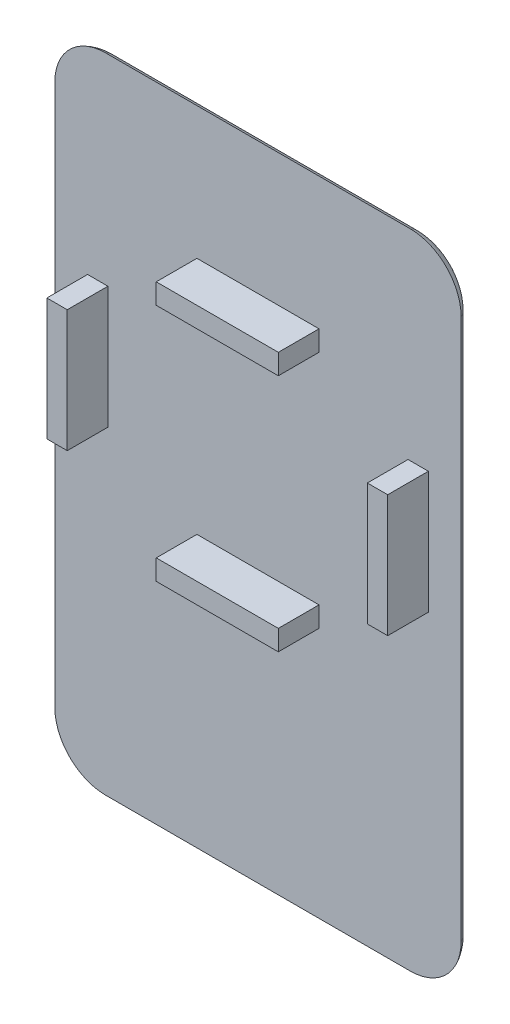
ISO-10303-21;
HEADER;
FILE_DESCRIPTION(('STEP AP214'),'2;1');
FILE_NAME('part.step','',(''),(''),'','','');
FILE_SCHEMA(('AUTOMOTIVE_DESIGN { 1 0 10303 214 1 1 1 1 }'));
ENDSEC;
DATA;
#1=APPLICATION_CONTEXT('core data for automotive mechanical design processes');
#2=APPLICATION_PROTOCOL_DEFINITION('international standard','automotive_design',2000,#1);
#3=PRODUCT_CONTEXT('',#1,'mechanical');
#4=PRODUCT('Part','Part','',(#3));
#5=PRODUCT_RELATED_PRODUCT_CATEGORY('part','',(#4));
#6=PRODUCT_DEFINITION_FORMATION('','',#4);
#7=PRODUCT_DEFINITION_CONTEXT('part definition',#1,'design');
#8=PRODUCT_DEFINITION('design','',#6,#7);
#9=PRODUCT_DEFINITION_SHAPE('','',#8);
#10=(LENGTH_UNIT() NAMED_UNIT(*) SI_UNIT(.MILLI.,.METRE.));
#11=(NAMED_UNIT(*) PLANE_ANGLE_UNIT() SI_UNIT($,.RADIAN.));
#12=(NAMED_UNIT(*) SI_UNIT($,.STERADIAN.) SOLID_ANGLE_UNIT());
#13=UNCERTAINTY_MEASURE_WITH_UNIT(LENGTH_MEASURE(1.E-05),#10,'distance_accuracy_value','');
#14=(GEOMETRIC_REPRESENTATION_CONTEXT(3) GLOBAL_UNCERTAINTY_ASSIGNED_CONTEXT((#13)) GLOBAL_UNIT_ASSIGNED_CONTEXT((#10,
#11,#12)) REPRESENTATION_CONTEXT('',''));
#15=CARTESIAN_POINT('',(0.,0.,0.));
#16=DIRECTION('',(0.,0.,1.));
#17=DIRECTION('',(1.,0.,0.));
#18=AXIS2_PLACEMENT_3D('',#15,#16,#17);
#19=CARTESIAN_POINT('',(0.,0.,1.2));
#20=DIRECTION('',(0.,0.,1.));
#21=DIRECTION('',(1.,0.,0.));
#22=AXIS2_PLACEMENT_3D('',#19,#20,#21);
#23=PLANE('',#22);
#24=DIRECTION('',(-1.,0.,0.));
#25=VECTOR('',#24,1.);
#26=CARTESIAN_POINT('',(-19.97,31.595,1.2));
#27=LINE('',#26,#25);
#28=CARTESIAN_POINT('',(14.97,31.595,1.2));
#29=VERTEX_POINT('',#28);
#30=CARTESIAN_POINT('',(-14.97,31.595,1.2));
#31=VERTEX_POINT('',#30);
#32=EDGE_CURVE('E364',#29,#31,#27,.T.);
#33=ORIENTED_EDGE('',*,*,#32,.T.);
#34=CARTESIAN_POINT('',(-14.97,26.595,1.2));
#35=DIRECTION('',(0.,0.,1.));
#36=DIRECTION('',(1.,0.,0.));
#37=AXIS2_PLACEMENT_3D('',#34,#35,#36);
#38=CIRCLE('',#37,5.);
#39=CARTESIAN_POINT('',(-19.97,26.595,1.2));
#40=VERTEX_POINT('',#39);
#41=EDGE_CURVE('E383',#31,#40,#38,.T.);
#42=ORIENTED_EDGE('',*,*,#41,.T.);
#43=DIRECTION('',(0.,-1.,0.));
#44=VECTOR('',#43,1.);
#45=CARTESIAN_POINT('',(-19.97,31.595,1.2));
#46=LINE('',#45,#44);
#47=CARTESIAN_POINT('',(-19.97,-26.595,1.2));
#48=VERTEX_POINT('',#47);
#49=EDGE_CURVE('E367',#40,#48,#46,.T.);
#50=ORIENTED_EDGE('',*,*,#49,.T.);
#51=CARTESIAN_POINT('',(-14.97,-26.595,1.2));
#52=DIRECTION('',(0.,0.,1.));
#53=DIRECTION('',(1.,0.,0.));
#54=AXIS2_PLACEMENT_3D('',#51,#52,#53);
#55=CIRCLE('',#54,5.);
#56=CARTESIAN_POINT('',(-14.97,-31.595,1.2));
#57=VERTEX_POINT('',#56);
#58=EDGE_CURVE('E373',#48,#57,#55,.T.);
#59=ORIENTED_EDGE('',*,*,#58,.T.);
#60=DIRECTION('',(1.,0.,0.));
#61=VECTOR('',#60,1.);
#62=CARTESIAN_POINT('',(-19.97,-31.595,1.2));
#63=LINE('',#62,#61);
#64=CARTESIAN_POINT('',(14.97,-31.595,1.2));
#65=VERTEX_POINT('',#64);
#66=EDGE_CURVE('E370',#57,#65,#63,.T.);
#67=ORIENTED_EDGE('',*,*,#66,.T.);
#68=CARTESIAN_POINT('',(14.97,-26.595,1.2));
#69=DIRECTION('',(0.,0.,1.));
#70=DIRECTION('',(1.,0.,0.));
#71=AXIS2_PLACEMENT_3D('',#68,#69,#70);
#72=CIRCLE('',#71,5.);
#73=CARTESIAN_POINT('',(19.97,-26.595,1.2));
#74=VERTEX_POINT('',#73);
#75=EDGE_CURVE('E377',#65,#74,#72,.T.);
#76=ORIENTED_EDGE('',*,*,#75,.T.);
#77=DIRECTION('',(0.,1.,0.));
#78=VECTOR('',#77,1.);
#79=CARTESIAN_POINT('',(19.97,31.595,1.2));
#80=LINE('',#79,#78);
#81=CARTESIAN_POINT('',(19.97,26.595,1.2));
#82=VERTEX_POINT('',#81);
#83=EDGE_CURVE('E361',#74,#82,#80,.T.);
#84=ORIENTED_EDGE('',*,*,#83,.T.);
#85=CARTESIAN_POINT('',(14.97,26.595,1.2));
#86=DIRECTION('',(0.,0.,1.));
#87=DIRECTION('',(1.,0.,0.));
#88=AXIS2_PLACEMENT_3D('',#85,#86,#87);
#89=CIRCLE('',#88,5.);
#90=EDGE_CURVE('E380',#82,#29,#89,.T.);
#91=ORIENTED_EDGE('',*,*,#90,.T.);
#92=EDGE_LOOP('',(#33,#42,#50,#59,#67,#76,#84,#91));
#93=FACE_BOUND('',#92,.T.);
#94=DIRECTION('',(-1.,0.,0.));
#95=VECTOR('',#94,1.);
#96=CARTESIAN_POINT('',(-5.99999999999997,18.595,1.2));
#97=LINE('',#96,#95);
#98=CARTESIAN_POINT('',(6.00000000000003,18.595,1.2));
#99=VERTEX_POINT('',#98);
#100=CARTESIAN_POINT('',(-5.99999999999997,18.595,1.2));
#101=VERTEX_POINT('',#100);
#102=EDGE_CURVE('E338',#99,#101,#97,.T.);
#103=ORIENTED_EDGE('',*,*,#102,.F.);
#104=DIRECTION('',(0.,1.,0.));
#105=VECTOR('',#104,1.);
#106=CARTESIAN_POINT('',(6.00000000000003,18.595,1.2));
#107=LINE('',#106,#105);
#108=CARTESIAN_POINT('',(6.00000000000003,16.595,1.2));
#109=VERTEX_POINT('',#108);
#110=EDGE_CURVE('E319',#109,#99,#107,.T.);
#111=ORIENTED_EDGE('',*,*,#110,.F.);
#112=DIRECTION('',(1.,0.,0.));
#113=VECTOR('',#112,1.);
#114=CARTESIAN_POINT('',(-5.99999999999997,16.595,1.2));
#115=LINE('',#114,#113);
#116=CARTESIAN_POINT('',(-5.99999999999997,16.595,1.2));
#117=VERTEX_POINT('',#116);
#118=EDGE_CURVE('E325',#117,#109,#115,.T.);
#119=ORIENTED_EDGE('',*,*,#118,.F.);
#120=DIRECTION('',(0.,-1.,0.));
#121=VECTOR('',#120,1.);
#122=CARTESIAN_POINT('',(-5.99999999999997,18.595,1.2));
#123=LINE('',#122,#121);
#124=EDGE_CURVE('E341',#101,#117,#123,.T.);
#125=ORIENTED_EDGE('',*,*,#124,.F.);
#126=EDGE_LOOP('',(#103,#111,#119,#125));
#127=FACE_BOUND('',#126,.T.);
#128=DIRECTION('',(-1.,0.,0.));
#129=VECTOR('',#128,1.);
#130=CARTESIAN_POINT('',(-6.00000000000001,-4.90499999999999,1.2));
#131=LINE('',#130,#129);
#132=CARTESIAN_POINT('',(6.00000000000003,-4.90499999999999,1.2));
#133=VERTEX_POINT('',#132);
#134=CARTESIAN_POINT('',(-6.00000000000001,-4.90499999999999,1.2));
#135=VERTEX_POINT('',#134);
#136=EDGE_CURVE('E297',#133,#135,#131,.T.);
#137=ORIENTED_EDGE('',*,*,#136,.F.);
#138=DIRECTION('',(0.,1.,0.));
#139=VECTOR('',#138,1.);
#140=CARTESIAN_POINT('',(6.00000000000003,-4.90499999999999,1.2));
#141=LINE('',#140,#139);
#142=CARTESIAN_POINT('',(6.00000000000003,-6.90499999999999,1.2));
#143=VERTEX_POINT('',#142);
#144=EDGE_CURVE('E278',#143,#133,#141,.T.);
#145=ORIENTED_EDGE('',*,*,#144,.F.);
#146=DIRECTION('',(1.,0.,0.));
#147=VECTOR('',#146,1.);
#148=CARTESIAN_POINT('',(-6.00000000000001,-6.90499999999999,1.2));
#149=LINE('',#148,#147);
#150=CARTESIAN_POINT('',(-6.00000000000001,-6.90499999999999,1.2));
#151=VERTEX_POINT('',#150);
#152=EDGE_CURVE('E284',#151,#143,#149,.T.);
#153=ORIENTED_EDGE('',*,*,#152,.F.);
#154=DIRECTION('',(0.,-1.,0.));
#155=VECTOR('',#154,1.);
#156=CARTESIAN_POINT('',(-6.00000000000001,-4.90499999999999,1.2));
#157=LINE('',#156,#155);
#158=EDGE_CURVE('E300',#135,#151,#157,.T.);
#159=ORIENTED_EDGE('',*,*,#158,.F.);
#160=EDGE_LOOP('',(#137,#145,#153,#159));
#161=FACE_BOUND('',#160,.T.);
#162=DIRECTION('',(-1.,0.,0.));
#163=VECTOR('',#162,1.);
#164=CARTESIAN_POINT('',(14.75,11.845,1.2));
#165=LINE('',#164,#163);
#166=CARTESIAN_POINT('',(16.75,11.845,1.2));
#167=VERTEX_POINT('',#166);
#168=CARTESIAN_POINT('',(14.75,11.845,1.2));
#169=VERTEX_POINT('',#168);
#170=EDGE_CURVE('E239',#167,#169,#165,.T.);
#171=ORIENTED_EDGE('',*,*,#170,.F.);
#172=DIRECTION('',(0.,1.,0.));
#173=VECTOR('',#172,1.);
#174=CARTESIAN_POINT('',(16.75,11.845,1.2));
#175=LINE('',#174,#173);
#176=CARTESIAN_POINT('',(16.75,-0.154999999999992,1.2));
#177=VERTEX_POINT('',#176);
#178=EDGE_CURVE('E234',#177,#167,#175,.T.);
#179=ORIENTED_EDGE('',*,*,#178,.F.);
#180=DIRECTION('',(1.,0.,0.));
#181=VECTOR('',#180,1.);
#182=CARTESIAN_POINT('',(14.75,-0.154999999999992,1.2));
#183=LINE('',#182,#181);
#184=CARTESIAN_POINT('',(14.75,-0.154999999999992,1.2));
#185=VERTEX_POINT('',#184);
#186=EDGE_CURVE('E249',#185,#177,#183,.T.);
#187=ORIENTED_EDGE('',*,*,#186,.F.);
#188=DIRECTION('',(0.,-1.,0.));
#189=VECTOR('',#188,1.);
#190=CARTESIAN_POINT('',(14.75,11.845,1.2));
#191=LINE('',#190,#189);
#192=EDGE_CURVE('E261',#169,#185,#191,.T.);
#193=ORIENTED_EDGE('',*,*,#192,.F.);
#194=EDGE_LOOP('',(#171,#179,#187,#193));
#195=FACE_BOUND('',#194,.T.);
#196=DIRECTION('',(-1.,0.,0.));
#197=VECTOR('',#196,1.);
#198=CARTESIAN_POINT('',(-14.75,11.845,1.2));
#199=LINE('',#198,#197);
#200=CARTESIAN_POINT('',(-14.75,11.845,1.2));
#201=VERTEX_POINT('',#200);
#202=CARTESIAN_POINT('',(-16.75,11.845,1.2));
#203=VERTEX_POINT('',#202);
#204=EDGE_CURVE('E761',#201,#203,#199,.T.);
#205=ORIENTED_EDGE('',*,*,#204,.F.);
#206=DIRECTION('',(0.,1.,0.));
#207=VECTOR('',#206,1.);
#208=CARTESIAN_POINT('',(-14.75,11.845,1.2));
#209=LINE('',#208,#207);
#210=CARTESIAN_POINT('',(-14.75,-0.154999999999995,1.2));
#211=VERTEX_POINT('',#210);
#212=EDGE_CURVE('E231',#211,#201,#209,.T.);
#213=ORIENTED_EDGE('',*,*,#212,.F.);
#214=DIRECTION('',(1.,0.,0.));
#215=VECTOR('',#214,1.);
#216=CARTESIAN_POINT('',(-14.75,-0.154999999999995,1.2));
#217=LINE('',#216,#215);
#218=CARTESIAN_POINT('',(-16.75,-0.154999999999996,1.2));
#219=VERTEX_POINT('',#218);
#220=EDGE_CURVE('E227',#219,#211,#217,.T.);
#221=ORIENTED_EDGE('',*,*,#220,.F.);
#222=DIRECTION('',(0.,-1.,0.));
#223=VECTOR('',#222,1.);
#224=CARTESIAN_POINT('',(-16.75,11.845,1.2));
#225=LINE('',#224,#223);
#226=EDGE_CURVE('E757',#203,#219,#225,.T.);
#227=ORIENTED_EDGE('',*,*,#226,.F.);
#228=EDGE_LOOP('',(#205,#213,#221,#227));
#229=FACE_BOUND('',#228,.T.);
#230=ADVANCED_FACE('F41',(#93,#127,#161,#195,#229),#23,.T.);
#231=CARTESIAN_POINT('',(0.,0.,0.));
#232=DIRECTION('',(0.,0.,1.));
#233=DIRECTION('',(1.,0.,0.));
#234=AXIS2_PLACEMENT_3D('',#231,#232,#233);
#235=PLANE('',#234);
#236=DIRECTION('',(1.,0.,0.));
#237=VECTOR('',#236,1.);
#238=CARTESIAN_POINT('',(0.,-29.7619697220177,0.));
#239=LINE('',#238,#237);
#240=CARTESIAN_POINT('',(14.97,-29.7619697220177,0.));
#241=VERTEX_POINT('',#240);
#242=CARTESIAN_POINT('',(-14.97,-29.7619697220177,0.));
#243=VERTEX_POINT('',#242);
#244=EDGE_CURVE('E51',#241,#243,#239,.F.);
#245=ORIENTED_EDGE('',*,*,#244,.T.);
#246=CARTESIAN_POINT('',(-14.97,-26.595,0.));
#247=DIRECTION('',(0.,0.,1.));
#248=DIRECTION('',(1.,0.,0.));
#249=AXIS2_PLACEMENT_3D('',#246,#247,#248);
#250=CIRCLE('',#249,3.16696972201766);
#251=CARTESIAN_POINT('',(-18.1369697220177,-26.595,0.));
#252=VERTEX_POINT('',#251);
#253=EDGE_CURVE('E11',#243,#252,#250,.F.);
#254=ORIENTED_EDGE('',*,*,#253,.T.);
#255=DIRECTION('',(0.,-1.,0.));
#256=VECTOR('',#255,1.);
#257=CARTESIAN_POINT('',(-18.1369697220177,0.,0.));
#258=LINE('',#257,#256);
#259=CARTESIAN_POINT('',(-18.1369697220177,26.595,0.));
#260=VERTEX_POINT('',#259);
#261=EDGE_CURVE('E386',#252,#260,#258,.F.);
#262=ORIENTED_EDGE('',*,*,#261,.T.);
#263=CARTESIAN_POINT('',(-14.97,26.595,0.));
#264=DIRECTION('',(0.,0.,1.));
#265=DIRECTION('',(1.,0.,0.));
#266=AXIS2_PLACEMENT_3D('',#263,#264,#265);
#267=CIRCLE('',#266,3.16696972201766);
#268=CARTESIAN_POINT('',(-14.97,29.7619697220177,0.));
#269=VERTEX_POINT('',#268);
#270=EDGE_CURVE('E389',#260,#269,#267,.F.);
#271=ORIENTED_EDGE('',*,*,#270,.T.);
#272=DIRECTION('',(-1.,0.,0.));
#273=VECTOR('',#272,1.);
#274=CARTESIAN_POINT('',(0.,29.7619697220177,0.));
#275=LINE('',#274,#273);
#276=CARTESIAN_POINT('',(14.97,29.7619697220177,0.));
#277=VERTEX_POINT('',#276);
#278=EDGE_CURVE('E392',#269,#277,#275,.F.);
#279=ORIENTED_EDGE('',*,*,#278,.T.);
#280=CARTESIAN_POINT('',(14.97,26.595,0.));
#281=DIRECTION('',(0.,0.,1.));
#282=DIRECTION('',(1.,0.,0.));
#283=AXIS2_PLACEMENT_3D('',#280,#281,#282);
#284=CIRCLE('',#283,3.16696972201766);
#285=CARTESIAN_POINT('',(18.1369697220177,26.595,0.));
#286=VERTEX_POINT('',#285);
#287=EDGE_CURVE('E395',#277,#286,#284,.F.);
#288=ORIENTED_EDGE('',*,*,#287,.T.);
#289=DIRECTION('',(0.,1.,0.));
#290=VECTOR('',#289,1.);
#291=CARTESIAN_POINT('',(18.1369697220177,0.,0.));
#292=LINE('',#291,#290);
#293=CARTESIAN_POINT('',(18.1369697220177,-26.595,0.));
#294=VERTEX_POINT('',#293);
#295=EDGE_CURVE('E398',#286,#294,#292,.F.);
#296=ORIENTED_EDGE('',*,*,#295,.T.);
#297=CARTESIAN_POINT('',(14.97,-26.595,0.));
#298=DIRECTION('',(0.,0.,1.));
#299=DIRECTION('',(1.,0.,0.));
#300=AXIS2_PLACEMENT_3D('',#297,#298,#299);
#301=CIRCLE('',#300,3.16696972201766);
#302=EDGE_CURVE('E401',#294,#241,#301,.F.);
#303=ORIENTED_EDGE('',*,*,#302,.T.);
#304=EDGE_LOOP('',(#245,#254,#262,#271,#279,#288,#296,#303));
#305=FACE_BOUND('',#304,.T.);
#306=ADVANCED_FACE('F459',(#305),#235,.F.);
#307=CARTESIAN_POINT('',(14.97,26.595,2.));
#308=DIRECTION('',(0.,0.,-1.));
#309=DIRECTION('',(-1.,0.,0.));
#310=AXIS2_PLACEMENT_3D('',#307,#308,#309);
#311=TOROIDAL_SURFACE('',#310,3.16696972201766,2.);
#312=CARTESIAN_POINT('',(14.97,29.7619697220177,2.));
#313=DIRECTION('',(-1.,0.,0.));
#314=DIRECTION('',(0.,0.,1.));
#315=AXIS2_PLACEMENT_3D('',#312,#313,#314);
#316=CIRCLE('',#315,2.);
#317=EDGE_CURVE('E426',#29,#277,#316,.T.);
#318=ORIENTED_EDGE('',*,*,#317,.F.);
#319=ORIENTED_EDGE('',*,*,#90,.F.);
#320=CARTESIAN_POINT('',(18.1369697220177,26.595,2.));
#321=DIRECTION('',(0.,-1.,0.));
#322=DIRECTION('',(0.,0.,-1.));
#323=AXIS2_PLACEMENT_3D('',#320,#321,#322);
#324=CIRCLE('',#323,2.);
#325=EDGE_CURVE('E45',#286,#82,#324,.T.);
#326=ORIENTED_EDGE('',*,*,#325,.F.);
#327=ORIENTED_EDGE('',*,*,#287,.F.);
#328=EDGE_LOOP('',(#318,#319,#326,#327));
#329=FACE_BOUND('',#328,.T.);
#330=ADVANCED_FACE('F43',(#329),#311,.T.);
#331=CARTESIAN_POINT('',(18.1369697220177,31.595,2.));
#332=DIRECTION('',(0.,1.,0.));
#333=DIRECTION('',(-1.,0.,0.));
#334=AXIS2_PLACEMENT_3D('',#331,#332,#333);
#335=CYLINDRICAL_SURFACE('',#334,2.);
#336=ORIENTED_EDGE('',*,*,#325,.T.);
#337=ORIENTED_EDGE('',*,*,#83,.F.);
#338=CARTESIAN_POINT('',(18.1369697220177,-26.595,2.));
#339=DIRECTION('',(0.,-1.,0.));
#340=DIRECTION('',(0.,0.,-1.));
#341=AXIS2_PLACEMENT_3D('',#338,#339,#340);
#342=CIRCLE('',#341,2.);
#343=EDGE_CURVE('E423',#294,#74,#342,.T.);
#344=ORIENTED_EDGE('',*,*,#343,.F.);
#345=ORIENTED_EDGE('',*,*,#295,.F.);
#346=EDGE_LOOP('',(#336,#337,#344,#345));
#347=FACE_BOUND('',#346,.T.);
#348=ADVANCED_FACE('F439',(#347),#335,.T.);
#349=CARTESIAN_POINT('',(-19.97,29.7619697220177,2.));
#350=DIRECTION('',(-1.,0.,0.));
#351=DIRECTION('',(0.,0.,1.));
#352=AXIS2_PLACEMENT_3D('',#349,#350,#351);
#353=CYLINDRICAL_SURFACE('',#352,2.);
#354=ORIENTED_EDGE('',*,*,#317,.T.);
#355=ORIENTED_EDGE('',*,*,#278,.F.);
#356=CARTESIAN_POINT('',(-14.97,29.7619697220177,2.));
#357=DIRECTION('',(-1.,0.,0.));
#358=DIRECTION('',(0.,0.,1.));
#359=AXIS2_PLACEMENT_3D('',#356,#357,#358);
#360=CIRCLE('',#359,2.);
#361=EDGE_CURVE('E419',#31,#269,#360,.T.);
#362=ORIENTED_EDGE('',*,*,#361,.F.);
#363=ORIENTED_EDGE('',*,*,#32,.F.);
#364=EDGE_LOOP('',(#354,#355,#362,#363));
#365=FACE_BOUND('',#364,.T.);
#366=ADVANCED_FACE('F461',(#365),#353,.T.);
#367=CARTESIAN_POINT('',(14.97,-26.595,2.));
#368=DIRECTION('',(0.,0.,-1.));
#369=DIRECTION('',(-1.,0.,0.));
#370=AXIS2_PLACEMENT_3D('',#367,#368,#369);
#371=TOROIDAL_SURFACE('',#370,3.16696972201766,2.);
#372=ORIENTED_EDGE('',*,*,#343,.T.);
#373=ORIENTED_EDGE('',*,*,#75,.F.);
#374=CARTESIAN_POINT('',(14.97,-29.7619697220177,2.));
#375=DIRECTION('',(-1.,0.,0.));
#376=DIRECTION('',(0.,-1.,0.));
#377=AXIS2_PLACEMENT_3D('',#374,#375,#376);
#378=CIRCLE('',#377,2.);
#379=EDGE_CURVE('E415',#241,#65,#378,.T.);
#380=ORIENTED_EDGE('',*,*,#379,.F.);
#381=ORIENTED_EDGE('',*,*,#302,.F.);
#382=EDGE_LOOP('',(#372,#373,#380,#381));
#383=FACE_BOUND('',#382,.T.);
#384=ADVANCED_FACE('F451',(#383),#371,.T.);
#385=CARTESIAN_POINT('',(-14.97,26.595,2.));
#386=DIRECTION('',(0.,0.,-1.));
#387=DIRECTION('',(-1.,0.,0.));
#388=AXIS2_PLACEMENT_3D('',#385,#386,#387);
#389=TOROIDAL_SURFACE('',#388,3.16696972201766,2.);
#390=ORIENTED_EDGE('',*,*,#361,.T.);
#391=ORIENTED_EDGE('',*,*,#270,.F.);
#392=CARTESIAN_POINT('',(-18.1369697220177,26.595,2.));
#393=DIRECTION('',(0.,-1.,0.));
#394=DIRECTION('',(0.,0.,-1.));
#395=AXIS2_PLACEMENT_3D('',#392,#393,#394);
#396=CIRCLE('',#395,2.);
#397=EDGE_CURVE('E411',#40,#260,#396,.T.);
#398=ORIENTED_EDGE('',*,*,#397,.F.);
#399=ORIENTED_EDGE('',*,*,#41,.F.);
#400=EDGE_LOOP('',(#390,#391,#398,#399));
#401=FACE_BOUND('',#400,.T.);
#402=ADVANCED_FACE('F464',(#401),#389,.T.);
#403=CARTESIAN_POINT('',(-19.97,-29.7619697220177,2.));
#404=DIRECTION('',(1.,0.,0.));
#405=DIRECTION('',(0.,0.,-1.));
#406=AXIS2_PLACEMENT_3D('',#403,#404,#405);
#407=CYLINDRICAL_SURFACE('',#406,2.);
#408=ORIENTED_EDGE('',*,*,#379,.T.);
#409=ORIENTED_EDGE('',*,*,#66,.F.);
#410=CARTESIAN_POINT('',(-14.97,-29.7619697220177,2.));
#411=DIRECTION('',(-1.,0.,0.));
#412=DIRECTION('',(0.,0.,1.));
#413=AXIS2_PLACEMENT_3D('',#410,#411,#412);
#414=CIRCLE('',#413,2.);
#415=EDGE_CURVE('E408',#243,#57,#414,.T.);
#416=ORIENTED_EDGE('',*,*,#415,.F.);
#417=ORIENTED_EDGE('',*,*,#244,.F.);
#418=EDGE_LOOP('',(#408,#409,#416,#417));
#419=FACE_BOUND('',#418,.T.);
#420=ADVANCED_FACE('F455',(#419),#407,.T.);
#421=CARTESIAN_POINT('',(-18.1369697220177,31.595,2.));
#422=DIRECTION('',(0.,-1.,0.));
#423=DIRECTION('',(1.,0.,0.));
#424=AXIS2_PLACEMENT_3D('',#421,#422,#423);
#425=CYLINDRICAL_SURFACE('',#424,2.);
#426=ORIENTED_EDGE('',*,*,#397,.T.);
#427=ORIENTED_EDGE('',*,*,#261,.F.);
#428=CARTESIAN_POINT('',(-18.1369697220177,-26.595,2.));
#429=DIRECTION('',(0.,-1.,0.));
#430=DIRECTION('',(0.,0.,-1.));
#431=AXIS2_PLACEMENT_3D('',#428,#429,#430);
#432=CIRCLE('',#431,2.);
#433=EDGE_CURVE('E360',#48,#252,#432,.T.);
#434=ORIENTED_EDGE('',*,*,#433,.F.);
#435=ORIENTED_EDGE('',*,*,#49,.F.);
#436=EDGE_LOOP('',(#426,#427,#434,#435));
#437=FACE_BOUND('',#436,.T.);
#438=ADVANCED_FACE('F473',(#437),#425,.T.);
#439=CARTESIAN_POINT('',(-14.97,-26.595,2.));
#440=DIRECTION('',(0.,0.,-1.));
#441=DIRECTION('',(-1.,0.,0.));
#442=AXIS2_PLACEMENT_3D('',#439,#440,#441);
#443=TOROIDAL_SURFACE('',#442,3.16696972201766,2.);
#444=ORIENTED_EDGE('',*,*,#415,.T.);
#445=ORIENTED_EDGE('',*,*,#58,.F.);
#446=ORIENTED_EDGE('',*,*,#433,.T.);
#447=ORIENTED_EDGE('',*,*,#253,.F.);
#448=EDGE_LOOP('',(#444,#445,#446,#447));
#449=FACE_BOUND('',#448,.T.);
#450=ADVANCED_FACE('F471',(#449),#443,.T.);
#451=CARTESIAN_POINT('',(6.00000000000003,18.595,5.2));
#452=DIRECTION('',(-1.,0.,0.));
#453=DIRECTION('',(0.,-1.,0.));
#454=AXIS2_PLACEMENT_3D('',#451,#452,#453);
#455=PLANE('',#454);
#456=ORIENTED_EDGE('',*,*,#110,.T.);
#457=DIRECTION('',(0.,0.,-1.));
#458=VECTOR('',#457,1.);
#459=CARTESIAN_POINT('',(6.00000000000003,18.595,5.2));
#460=LINE('',#459,#458);
#461=CARTESIAN_POINT('',(6.00000000000003,18.595,5.2));
#462=VERTEX_POINT('',#461);
#463=EDGE_CURVE('E357',#462,#99,#460,.T.);
#464=ORIENTED_EDGE('',*,*,#463,.F.);
#465=DIRECTION('',(0.,1.,0.));
#466=VECTOR('',#465,1.);
#467=CARTESIAN_POINT('',(6.00000000000003,18.595,5.2));
#468=LINE('',#467,#466);
#469=CARTESIAN_POINT('',(6.00000000000003,16.595,5.2));
#470=VERTEX_POINT('',#469);
#471=EDGE_CURVE('E320',#470,#462,#468,.T.);
#472=ORIENTED_EDGE('',*,*,#471,.F.);
#473=DIRECTION('',(0.,0.,-1.));
#474=VECTOR('',#473,1.);
#475=CARTESIAN_POINT('',(6.00000000000003,16.595,5.2));
#476=LINE('',#475,#474);
#477=EDGE_CURVE('E334',#470,#109,#476,.T.);
#478=ORIENTED_EDGE('',*,*,#477,.T.);
#479=EDGE_LOOP('',(#456,#464,#472,#478));
#480=FACE_BOUND('',#479,.T.);
#481=ADVANCED_FACE('F480',(#480),#455,.F.);
#482=CARTESIAN_POINT('',(-5.99999999999997,18.595,5.2));
#483=DIRECTION('',(0.,-1.,0.));
#484=DIRECTION('',(0.,0.,-1.));
#485=AXIS2_PLACEMENT_3D('',#482,#483,#484);
#486=PLANE('',#485);
#487=ORIENTED_EDGE('',*,*,#102,.T.);
#488=DIRECTION('',(0.,0.,-1.));
#489=VECTOR('',#488,1.);
#490=CARTESIAN_POINT('',(-5.99999999999997,18.595,5.2));
#491=LINE('',#490,#489);
#492=CARTESIAN_POINT('',(-5.99999999999997,18.595,5.2));
#493=VERTEX_POINT('',#492);
#494=EDGE_CURVE('E353',#493,#101,#491,.T.);
#495=ORIENTED_EDGE('',*,*,#494,.F.);
#496=DIRECTION('',(-1.,0.,0.));
#497=VECTOR('',#496,1.);
#498=CARTESIAN_POINT('',(-5.99999999999997,18.595,5.2));
#499=LINE('',#498,#497);
#500=EDGE_CURVE('E324',#462,#493,#499,.T.);
#501=ORIENTED_EDGE('',*,*,#500,.F.);
#502=ORIENTED_EDGE('',*,*,#463,.T.);
#503=EDGE_LOOP('',(#487,#495,#501,#502));
#504=FACE_BOUND('',#503,.T.);
#505=ADVANCED_FACE('F492',(#504),#486,.F.);
#506=CARTESIAN_POINT('',(-5.99999999999997,18.595,5.2));
#507=DIRECTION('',(1.,0.,0.));
#508=DIRECTION('',(0.,1.,0.));
#509=AXIS2_PLACEMENT_3D('',#506,#507,#508);
#510=PLANE('',#509);
#511=ORIENTED_EDGE('',*,*,#124,.T.);
#512=DIRECTION('',(0.,0.,-1.));
#513=VECTOR('',#512,1.);
#514=CARTESIAN_POINT('',(-5.99999999999997,16.595,5.2));
#515=LINE('',#514,#513);
#516=CARTESIAN_POINT('',(-5.99999999999997,16.595,5.2));
#517=VERTEX_POINT('',#516);
#518=EDGE_CURVE('E350',#517,#117,#515,.T.);
#519=ORIENTED_EDGE('',*,*,#518,.F.);
#520=DIRECTION('',(0.,-1.,0.));
#521=VECTOR('',#520,1.);
#522=CARTESIAN_POINT('',(-5.99999999999997,18.595,5.2));
#523=LINE('',#522,#521);
#524=EDGE_CURVE('E328',#493,#517,#523,.T.);
#525=ORIENTED_EDGE('',*,*,#524,.F.);
#526=ORIENTED_EDGE('',*,*,#494,.T.);
#527=EDGE_LOOP('',(#511,#519,#525,#526));
#528=FACE_BOUND('',#527,.T.);
#529=ADVANCED_FACE('F496',(#528),#510,.F.);
#530=CARTESIAN_POINT('',(-5.99999999999997,16.595,5.2));
#531=DIRECTION('',(0.,1.,0.));
#532=DIRECTION('',(-1.,0.,0.));
#533=AXIS2_PLACEMENT_3D('',#530,#531,#532);
#534=PLANE('',#533);
#535=ORIENTED_EDGE('',*,*,#118,.T.);
#536=ORIENTED_EDGE('',*,*,#477,.F.);
#537=DIRECTION('',(1.,0.,0.));
#538=VECTOR('',#537,1.);
#539=CARTESIAN_POINT('',(-5.99999999999997,16.595,5.2));
#540=LINE('',#539,#538);
#541=EDGE_CURVE('E331',#517,#470,#540,.T.);
#542=ORIENTED_EDGE('',*,*,#541,.F.);
#543=ORIENTED_EDGE('',*,*,#518,.T.);
#544=EDGE_LOOP('',(#535,#536,#542,#543));
#545=FACE_BOUND('',#544,.T.);
#546=ADVANCED_FACE('F500',(#545),#534,.F.);
#547=CARTESIAN_POINT('',(0.,0.,5.2));
#548=DIRECTION('',(0.,0.,1.));
#549=DIRECTION('',(1.,0.,0.));
#550=AXIS2_PLACEMENT_3D('',#547,#548,#549);
#551=PLANE('',#550);
#552=ORIENTED_EDGE('',*,*,#471,.T.);
#553=ORIENTED_EDGE('',*,*,#500,.T.);
#554=ORIENTED_EDGE('',*,*,#524,.T.);
#555=ORIENTED_EDGE('',*,*,#541,.T.);
#556=EDGE_LOOP('',(#552,#553,#554,#555));
#557=FACE_BOUND('',#556,.T.);
#558=ADVANCED_FACE('F504',(#557),#551,.T.);
#559=CARTESIAN_POINT('',(6.00000000000003,-4.90499999999999,5.2));
#560=DIRECTION('',(-1.,0.,0.));
#561=DIRECTION('',(0.,-1.,0.));
#562=AXIS2_PLACEMENT_3D('',#559,#560,#561);
#563=PLANE('',#562);
#564=ORIENTED_EDGE('',*,*,#144,.T.);
#565=DIRECTION('',(0.,0.,-1.));
#566=VECTOR('',#565,1.);
#567=CARTESIAN_POINT('',(6.00000000000003,-4.90499999999999,5.2));
#568=LINE('',#567,#566);
#569=CARTESIAN_POINT('',(6.00000000000003,-4.90499999999999,5.2));
#570=VERTEX_POINT('',#569);
#571=EDGE_CURVE('E316',#570,#133,#568,.T.);
#572=ORIENTED_EDGE('',*,*,#571,.F.);
#573=DIRECTION('',(0.,1.,0.));
#574=VECTOR('',#573,1.);
#575=CARTESIAN_POINT('',(6.00000000000003,-4.90499999999999,5.2));
#576=LINE('',#575,#574);
#577=CARTESIAN_POINT('',(6.00000000000003,-6.90499999999999,5.2));
#578=VERTEX_POINT('',#577);
#579=EDGE_CURVE('E279',#578,#570,#576,.T.);
#580=ORIENTED_EDGE('',*,*,#579,.F.);
#581=DIRECTION('',(0.,0.,-1.));
#582=VECTOR('',#581,1.);
#583=CARTESIAN_POINT('',(6.00000000000003,-6.90499999999999,5.2));
#584=LINE('',#583,#582);
#585=EDGE_CURVE('E293',#578,#143,#584,.T.);
#586=ORIENTED_EDGE('',*,*,#585,.T.);
#587=EDGE_LOOP('',(#564,#572,#580,#586));
#588=FACE_BOUND('',#587,.T.);
#589=ADVANCED_FACE('F508',(#588),#563,.F.);
#590=CARTESIAN_POINT('',(-6.00000000000001,-4.90499999999999,5.2));
#591=DIRECTION('',(0.,-1.,0.));
#592=DIRECTION('',(0.,0.,-1.));
#593=AXIS2_PLACEMENT_3D('',#590,#591,#592);
#594=PLANE('',#593);
#595=ORIENTED_EDGE('',*,*,#136,.T.);
#596=DIRECTION('',(0.,0.,-1.));
#597=VECTOR('',#596,1.);
#598=CARTESIAN_POINT('',(-6.00000000000001,-4.90499999999999,5.2));
#599=LINE('',#598,#597);
#600=CARTESIAN_POINT('',(-6.00000000000001,-4.90499999999999,5.2));
#601=VERTEX_POINT('',#600);
#602=EDGE_CURVE('E312',#601,#135,#599,.T.);
#603=ORIENTED_EDGE('',*,*,#602,.F.);
#604=DIRECTION('',(-1.,0.,0.));
#605=VECTOR('',#604,1.);
#606=CARTESIAN_POINT('',(-6.00000000000001,-4.90499999999999,5.2));
#607=LINE('',#606,#605);
#608=EDGE_CURVE('E283',#570,#601,#607,.T.);
#609=ORIENTED_EDGE('',*,*,#608,.F.);
#610=ORIENTED_EDGE('',*,*,#571,.T.);
#611=EDGE_LOOP('',(#595,#603,#609,#610));
#612=FACE_BOUND('',#611,.T.);
#613=ADVANCED_FACE('F512',(#612),#594,.F.);
#614=CARTESIAN_POINT('',(-6.00000000000001,-4.90499999999999,5.2));
#615=DIRECTION('',(1.,0.,0.));
#616=DIRECTION('',(0.,0.,-1.));
#617=AXIS2_PLACEMENT_3D('',#614,#615,#616);
#618=PLANE('',#617);
#619=ORIENTED_EDGE('',*,*,#158,.T.);
#620=DIRECTION('',(0.,0.,-1.));
#621=VECTOR('',#620,1.);
#622=CARTESIAN_POINT('',(-6.00000000000001,-6.90499999999999,5.2));
#623=LINE('',#622,#621);
#624=CARTESIAN_POINT('',(-6.00000000000001,-6.90499999999999,5.2));
#625=VERTEX_POINT('',#624);
#626=EDGE_CURVE('E309',#625,#151,#623,.T.);
#627=ORIENTED_EDGE('',*,*,#626,.F.);
#628=DIRECTION('',(0.,-1.,0.));
#629=VECTOR('',#628,1.);
#630=CARTESIAN_POINT('',(-6.00000000000001,-4.90499999999999,5.2));
#631=LINE('',#630,#629);
#632=EDGE_CURVE('E287',#601,#625,#631,.T.);
#633=ORIENTED_EDGE('',*,*,#632,.F.);
#634=ORIENTED_EDGE('',*,*,#602,.T.);
#635=EDGE_LOOP('',(#619,#627,#633,#634));
#636=FACE_BOUND('',#635,.T.);
#637=ADVANCED_FACE('F516',(#636),#618,.F.);
#638=CARTESIAN_POINT('',(-6.00000000000001,-6.90499999999999,5.2));
#639=DIRECTION('',(0.,1.,0.));
#640=DIRECTION('',(0.,0.,1.));
#641=AXIS2_PLACEMENT_3D('',#638,#639,#640);
#642=PLANE('',#641);
#643=ORIENTED_EDGE('',*,*,#152,.T.);
#644=ORIENTED_EDGE('',*,*,#585,.F.);
#645=DIRECTION('',(1.,0.,0.));
#646=VECTOR('',#645,1.);
#647=CARTESIAN_POINT('',(-6.00000000000001,-6.90499999999999,5.2));
#648=LINE('',#647,#646);
#649=EDGE_CURVE('E290',#625,#578,#648,.T.);
#650=ORIENTED_EDGE('',*,*,#649,.F.);
#651=ORIENTED_EDGE('',*,*,#626,.T.);
#652=EDGE_LOOP('',(#643,#644,#650,#651));
#653=FACE_BOUND('',#652,.T.);
#654=ADVANCED_FACE('F520',(#653),#642,.F.);
#655=CARTESIAN_POINT('',(0.,0.,5.2));
#656=DIRECTION('',(0.,0.,1.));
#657=DIRECTION('',(1.,0.,0.));
#658=AXIS2_PLACEMENT_3D('',#655,#656,#657);
#659=PLANE('',#658);
#660=ORIENTED_EDGE('',*,*,#579,.T.);
#661=ORIENTED_EDGE('',*,*,#608,.T.);
#662=ORIENTED_EDGE('',*,*,#632,.T.);
#663=ORIENTED_EDGE('',*,*,#649,.T.);
#664=EDGE_LOOP('',(#660,#661,#662,#663));
#665=FACE_BOUND('',#664,.T.);
#666=ADVANCED_FACE('F524',(#665),#659,.T.);
#667=CARTESIAN_POINT('',(16.75,11.845,5.2));
#668=DIRECTION('',(-1.,0.,0.));
#669=DIRECTION('',(0.,0.,1.));
#670=AXIS2_PLACEMENT_3D('',#667,#668,#669);
#671=PLANE('',#670);
#672=ORIENTED_EDGE('',*,*,#178,.T.);
#673=DIRECTION('',(0.,0.,-1.));
#674=VECTOR('',#673,1.);
#675=CARTESIAN_POINT('',(16.75,11.845,5.2));
#676=LINE('',#675,#674);
#677=CARTESIAN_POINT('',(16.75,11.845,5.2));
#678=VERTEX_POINT('',#677);
#679=EDGE_CURVE('E275',#678,#167,#676,.T.);
#680=ORIENTED_EDGE('',*,*,#679,.F.);
#681=DIRECTION('',(0.,1.,0.));
#682=VECTOR('',#681,1.);
#683=CARTESIAN_POINT('',(16.75,11.845,5.2));
#684=LINE('',#683,#682);
#685=CARTESIAN_POINT('',(16.75,-0.154999999999992,5.2));
#686=VERTEX_POINT('',#685);
#687=EDGE_CURVE('E244',#686,#678,#684,.T.);
#688=ORIENTED_EDGE('',*,*,#687,.F.);
#689=DIRECTION('',(0.,0.,-1.));
#690=VECTOR('',#689,1.);
#691=CARTESIAN_POINT('',(16.75,-0.154999999999992,5.2));
#692=LINE('',#691,#690);
#693=EDGE_CURVE('E257',#686,#177,#692,.T.);
#694=ORIENTED_EDGE('',*,*,#693,.T.);
#695=EDGE_LOOP('',(#672,#680,#688,#694));
#696=FACE_BOUND('',#695,.T.);
#697=ADVANCED_FACE('F528',(#696),#671,.F.);
#698=CARTESIAN_POINT('',(14.75,11.845,5.2));
#699=DIRECTION('',(0.,-1.,0.));
#700=DIRECTION('',(0.,0.,-1.));
#701=AXIS2_PLACEMENT_3D('',#698,#699,#700);
#702=PLANE('',#701);
#703=ORIENTED_EDGE('',*,*,#170,.T.);
#704=DIRECTION('',(0.,0.,-1.));
#705=VECTOR('',#704,1.);
#706=CARTESIAN_POINT('',(14.75,11.845,5.2));
#707=LINE('',#706,#705);
#708=CARTESIAN_POINT('',(14.75,11.845,5.2));
#709=VERTEX_POINT('',#708);
#710=EDGE_CURVE('E271',#709,#169,#707,.T.);
#711=ORIENTED_EDGE('',*,*,#710,.F.);
#712=DIRECTION('',(-1.,0.,0.));
#713=VECTOR('',#712,1.);
#714=CARTESIAN_POINT('',(14.75,11.845,5.2));
#715=LINE('',#714,#713);
#716=EDGE_CURVE('E248',#678,#709,#715,.T.);
#717=ORIENTED_EDGE('',*,*,#716,.F.);
#718=ORIENTED_EDGE('',*,*,#679,.T.);
#719=EDGE_LOOP('',(#703,#711,#717,#718));
#720=FACE_BOUND('',#719,.T.);
#721=ADVANCED_FACE('F532',(#720),#702,.F.);
#722=CARTESIAN_POINT('',(14.75,11.845,5.2));
#723=DIRECTION('',(1.,0.,0.));
#724=DIRECTION('',(0.,0.,-1.));
#725=AXIS2_PLACEMENT_3D('',#722,#723,#724);
#726=PLANE('',#725);
#727=ORIENTED_EDGE('',*,*,#192,.T.);
#728=DIRECTION('',(0.,0.,-1.));
#729=VECTOR('',#728,1.);
#730=CARTESIAN_POINT('',(14.75,-0.154999999999992,5.2));
#731=LINE('',#730,#729);
#732=CARTESIAN_POINT('',(14.75,-0.154999999999992,5.2));
#733=VERTEX_POINT('',#732);
#734=EDGE_CURVE('E67',#733,#185,#731,.T.);
#735=ORIENTED_EDGE('',*,*,#734,.F.);
#736=DIRECTION('',(0.,-1.,0.));
#737=VECTOR('',#736,1.);
#738=CARTESIAN_POINT('',(14.75,11.845,5.2));
#739=LINE('',#738,#737);
#740=EDGE_CURVE('E252',#709,#733,#739,.T.);
#741=ORIENTED_EDGE('',*,*,#740,.F.);
#742=ORIENTED_EDGE('',*,*,#710,.T.);
#743=EDGE_LOOP('',(#727,#735,#741,#742));
#744=FACE_BOUND('',#743,.T.);
#745=ADVANCED_FACE('F536',(#744),#726,.F.);
#746=CARTESIAN_POINT('',(14.75,-0.154999999999992,5.2));
#747=DIRECTION('',(0.,1.,0.));
#748=DIRECTION('',(0.,0.,1.));
#749=AXIS2_PLACEMENT_3D('',#746,#747,#748);
#750=PLANE('',#749);
#751=ORIENTED_EDGE('',*,*,#186,.T.);
#752=ORIENTED_EDGE('',*,*,#693,.F.);
#753=DIRECTION('',(1.,0.,0.));
#754=VECTOR('',#753,1.);
#755=CARTESIAN_POINT('',(14.75,-0.154999999999992,5.2));
#756=LINE('',#755,#754);
#757=EDGE_CURVE('E255',#733,#686,#756,.T.);
#758=ORIENTED_EDGE('',*,*,#757,.F.);
#759=ORIENTED_EDGE('',*,*,#734,.T.);
#760=EDGE_LOOP('',(#751,#752,#758,#759));
#761=FACE_BOUND('',#760,.T.);
#762=ADVANCED_FACE('F540',(#761),#750,.F.);
#763=CARTESIAN_POINT('',(0.,0.,5.2));
#764=DIRECTION('',(0.,0.,1.));
#765=DIRECTION('',(1.,0.,0.));
#766=AXIS2_PLACEMENT_3D('',#763,#764,#765);
#767=PLANE('',#766);
#768=ORIENTED_EDGE('',*,*,#687,.T.);
#769=ORIENTED_EDGE('',*,*,#716,.T.);
#770=ORIENTED_EDGE('',*,*,#740,.T.);
#771=ORIENTED_EDGE('',*,*,#757,.T.);
#772=EDGE_LOOP('',(#768,#769,#770,#771));
#773=FACE_BOUND('',#772,.T.);
#774=ADVANCED_FACE('F544',(#773),#767,.T.);
#775=CARTESIAN_POINT('',(-14.75,11.845,5.2));
#776=DIRECTION('',(-1.,0.,0.));
#777=DIRECTION('',(0.,-1.,0.));
#778=AXIS2_PLACEMENT_3D('',#775,#776,#777);
#779=PLANE('',#778);
#780=ORIENTED_EDGE('',*,*,#212,.T.);
#781=DIRECTION('',(0.,0.,-1.));
#782=VECTOR('',#781,1.);
#783=CARTESIAN_POINT('',(-14.75,11.845,5.2));
#784=LINE('',#783,#782);
#785=CARTESIAN_POINT('',(-14.75,11.845,5.2));
#786=VERTEX_POINT('',#785);
#787=EDGE_CURVE('E210',#786,#201,#784,.T.);
#788=ORIENTED_EDGE('',*,*,#787,.F.);
#789=DIRECTION('',(0.,1.,0.));
#790=VECTOR('',#789,1.);
#791=CARTESIAN_POINT('',(-14.75,11.845,5.2));
#792=LINE('',#791,#790);
#793=CARTESIAN_POINT('',(-14.75,-0.154999999999995,5.2));
#794=VERTEX_POINT('',#793);
#795=EDGE_CURVE('E218',#794,#786,#792,.T.);
#796=ORIENTED_EDGE('',*,*,#795,.F.);
#797=DIRECTION('',(0.,0.,-1.));
#798=VECTOR('',#797,1.);
#799=CARTESIAN_POINT('',(-14.75,-0.154999999999995,5.2));
#800=LINE('',#799,#798);
#801=EDGE_CURVE('E753',#794,#211,#800,.T.);
#802=ORIENTED_EDGE('',*,*,#801,.T.);
#803=EDGE_LOOP('',(#780,#788,#796,#802));
#804=FACE_BOUND('',#803,.T.);
#805=ADVANCED_FACE('F229',(#804),#779,.F.);
#806=CARTESIAN_POINT('',(-14.75,11.845,5.2));
#807=DIRECTION('',(0.,-1.,0.));
#808=DIRECTION('',(0.,0.,-1.));
#809=AXIS2_PLACEMENT_3D('',#806,#807,#808);
#810=PLANE('',#809);
#811=ORIENTED_EDGE('',*,*,#204,.T.);
#812=DIRECTION('',(0.,0.,-1.));
#813=VECTOR('',#812,1.);
#814=CARTESIAN_POINT('',(-16.75,11.845,5.2));
#815=LINE('',#814,#813);
#816=CARTESIAN_POINT('',(-16.75,11.845,5.2));
#817=VERTEX_POINT('',#816);
#818=EDGE_CURVE('E213',#817,#203,#815,.T.);
#819=ORIENTED_EDGE('',*,*,#818,.F.);
#820=DIRECTION('',(-1.,0.,0.));
#821=VECTOR('',#820,1.);
#822=CARTESIAN_POINT('',(-14.75,11.845,5.2));
#823=LINE('',#822,#821);
#824=EDGE_CURVE('E206',#786,#817,#823,.T.);
#825=ORIENTED_EDGE('',*,*,#824,.F.);
#826=ORIENTED_EDGE('',*,*,#787,.T.);
#827=EDGE_LOOP('',(#811,#819,#825,#826));
#828=FACE_BOUND('',#827,.T.);
#829=ADVANCED_FACE('F208',(#828),#810,.F.);
#830=CARTESIAN_POINT('',(-16.75,11.845,5.2));
#831=DIRECTION('',(1.,0.,0.));
#832=DIRECTION('',(0.,0.,-1.));
#833=AXIS2_PLACEMENT_3D('',#830,#831,#832);
#834=PLANE('',#833);
#835=ORIENTED_EDGE('',*,*,#226,.T.);
#836=DIRECTION('',(0.,0.,-1.));
#837=VECTOR('',#836,1.);
#838=CARTESIAN_POINT('',(-16.75,-0.154999999999996,5.2));
#839=LINE('',#838,#837);
#840=CARTESIAN_POINT('',(-16.75,-0.154999999999996,5.2));
#841=VERTEX_POINT('',#840);
#842=EDGE_CURVE('E59',#841,#219,#839,.T.);
#843=ORIENTED_EDGE('',*,*,#842,.F.);
#844=DIRECTION('',(0.,-1.,0.));
#845=VECTOR('',#844,1.);
#846=CARTESIAN_POINT('',(-16.75,11.845,5.2));
#847=LINE('',#846,#845);
#848=EDGE_CURVE('E217',#817,#841,#847,.T.);
#849=ORIENTED_EDGE('',*,*,#848,.F.);
#850=ORIENTED_EDGE('',*,*,#818,.T.);
#851=EDGE_LOOP('',(#835,#843,#849,#850));
#852=FACE_BOUND('',#851,.T.);
#853=ADVANCED_FACE('F552',(#852),#834,.F.);
#854=CARTESIAN_POINT('',(-14.75,-0.154999999999995,5.2));
#855=DIRECTION('',(0.,1.,0.));
#856=DIRECTION('',(-1.,0.,0.));
#857=AXIS2_PLACEMENT_3D('',#854,#855,#856);
#858=PLANE('',#857);
#859=ORIENTED_EDGE('',*,*,#220,.T.);
#860=ORIENTED_EDGE('',*,*,#801,.F.);
#861=DIRECTION('',(1.,0.,0.));
#862=VECTOR('',#861,1.);
#863=CARTESIAN_POINT('',(-14.75,-0.154999999999995,5.2));
#864=LINE('',#863,#862);
#865=EDGE_CURVE('E222',#841,#794,#864,.T.);
#866=ORIENTED_EDGE('',*,*,#865,.F.);
#867=ORIENTED_EDGE('',*,*,#842,.T.);
#868=EDGE_LOOP('',(#859,#860,#866,#867));
#869=FACE_BOUND('',#868,.T.);
#870=ADVANCED_FACE('F555',(#869),#858,.F.);
#871=CARTESIAN_POINT('',(0.,0.,5.2));
#872=DIRECTION('',(0.,0.,-1.));
#873=DIRECTION('',(-1.,0.,0.));
#874=AXIS2_PLACEMENT_3D('',#871,#872,#873);
#875=PLANE('',#874);
#876=ORIENTED_EDGE('',*,*,#795,.T.);
#877=ORIENTED_EDGE('',*,*,#824,.T.);
#878=ORIENTED_EDGE('',*,*,#848,.T.);
#879=ORIENTED_EDGE('',*,*,#865,.T.);
#880=EDGE_LOOP('',(#876,#877,#878,#879));
#881=FACE_BOUND('',#880,.T.);
#882=ADVANCED_FACE('F221',(#881),#875,.F.);
#883=CLOSED_SHELL('',(#230,#306,#330,#348,#366,#384,#402,#420,#438,#450,#481,#505,#529,#546,
#558,#589,#613,#637,#654,#666,#697,#721,#745,#762,#774,#805,#829,#853,#870,#882));
#884=MANIFOLD_SOLID_BREP('B2',#883);
#885=ADVANCED_BREP_SHAPE_REPRESENTATION('',(#18,#884),#14);
#886=SHAPE_DEFINITION_REPRESENTATION(#9,#885);
ENDSEC;
END-ISO-10303-21;
